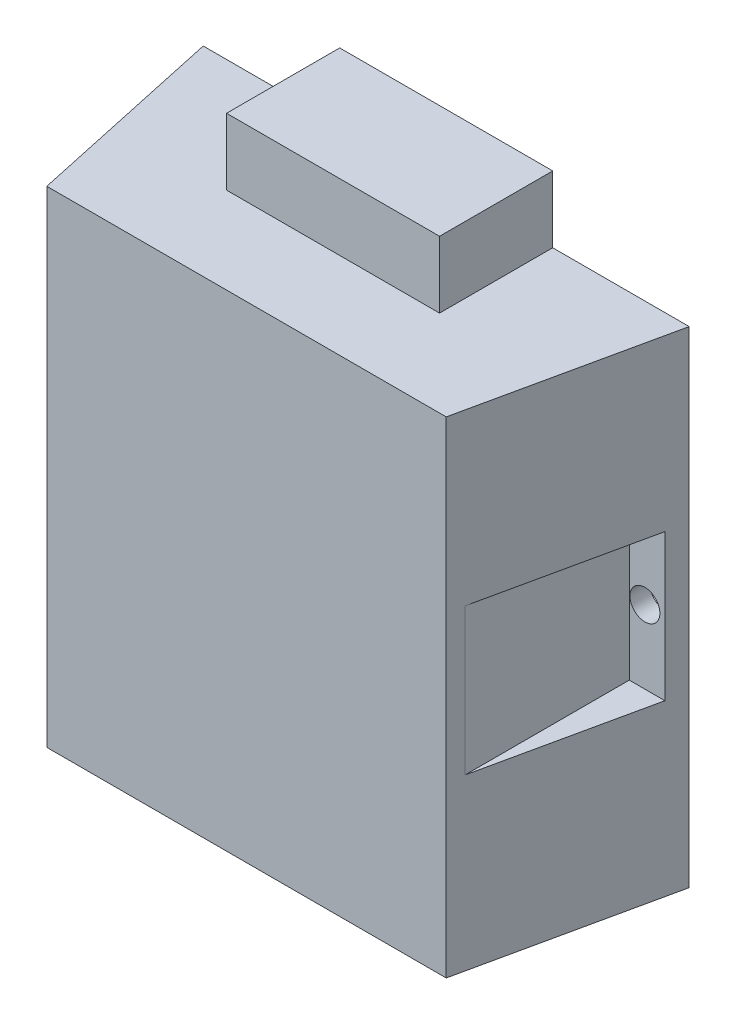
ISO-10303-21;
HEADER;
FILE_DESCRIPTION(('STEP AP214'),'2;1');
FILE_NAME('part.step','',(''),(''),'','','');
FILE_SCHEMA(('AUTOMOTIVE_DESIGN { 1 0 10303 214 1 1 1 1 }'));
ENDSEC;
DATA;
#1=APPLICATION_CONTEXT('core data for automotive mechanical design processes');
#2=APPLICATION_PROTOCOL_DEFINITION('international standard','automotive_design',2000,#1);
#3=PRODUCT_CONTEXT('',#1,'mechanical');
#4=PRODUCT('Part','Part','',(#3));
#5=PRODUCT_RELATED_PRODUCT_CATEGORY('part','',(#4));
#6=PRODUCT_DEFINITION_FORMATION('','',#4);
#7=PRODUCT_DEFINITION_CONTEXT('part definition',#1,'design');
#8=PRODUCT_DEFINITION('design','',#6,#7);
#9=PRODUCT_DEFINITION_SHAPE('','',#8);
#10=(LENGTH_UNIT() NAMED_UNIT(*) SI_UNIT(.MILLI.,.METRE.));
#11=(NAMED_UNIT(*) PLANE_ANGLE_UNIT() SI_UNIT($,.RADIAN.));
#12=(NAMED_UNIT(*) SI_UNIT($,.STERADIAN.) SOLID_ANGLE_UNIT());
#13=UNCERTAINTY_MEASURE_WITH_UNIT(LENGTH_MEASURE(1.E-05),#10,'distance_accuracy_value','');
#14=(GEOMETRIC_REPRESENTATION_CONTEXT(3) GLOBAL_UNCERTAINTY_ASSIGNED_CONTEXT((#13)) GLOBAL_UNIT_ASSIGNED_CONTEXT((#10,
#11,#12)) REPRESENTATION_CONTEXT('',''));
#15=CARTESIAN_POINT('',(0.,0.,0.));
#16=DIRECTION('',(0.,0.,1.));
#17=DIRECTION('',(1.,0.,0.));
#18=AXIS2_PLACEMENT_3D('',#15,#16,#17);
#19=CARTESIAN_POINT('',(0.,73.,0.));
#20=DIRECTION('',(0.,-1.,0.));
#21=DIRECTION('',(0.,0.,-1.));
#22=AXIS2_PLACEMENT_3D('',#19,#20,#21);
#23=PLANE('',#22);
#24=DIRECTION('',(0.,0.,-1.));
#25=VECTOR('',#24,1.);
#26=CARTESIAN_POINT('',(16.,73.,-13.));
#27=LINE('',#26,#25);
#28=CARTESIAN_POINT('',(16.,73.,-13.));
#29=VERTEX_POINT('',#28);
#30=CARTESIAN_POINT('',(16.,73.,-30.));
#31=VERTEX_POINT('',#30);
#32=EDGE_CURVE('E168',#29,#31,#27,.T.);
#33=ORIENTED_EDGE('',*,*,#32,.F.);
#34=DIRECTION('',(1.,0.,0.));
#35=VECTOR('',#34,1.);
#36=CARTESIAN_POINT('',(-16.,73.,-13.));
#37=LINE('',#36,#35);
#38=CARTESIAN_POINT('',(-16.,73.,-13.));
#39=VERTEX_POINT('',#38);
#40=EDGE_CURVE('E174',#39,#29,#37,.T.);
#41=ORIENTED_EDGE('',*,*,#40,.F.);
#42=DIRECTION('',(0.,0.,1.));
#43=VECTOR('',#42,1.);
#44=CARTESIAN_POINT('',(-16.,73.,-13.));
#45=LINE('',#44,#43);
#46=CARTESIAN_POINT('',(-16.,73.,-30.));
#47=VERTEX_POINT('',#46);
#48=EDGE_CURVE('E183',#47,#39,#45,.T.);
#49=ORIENTED_EDGE('',*,*,#48,.F.);
#50=DIRECTION('',(-1.,0.,0.));
#51=VECTOR('',#50,1.);
#52=CARTESIAN_POINT('',(-36.5,73.,-30.));
#53=LINE('',#52,#51);
#54=CARTESIAN_POINT('',(-36.5,73.,-30.));
#55=VERTEX_POINT('',#54);
#56=EDGE_CURVE('E208',#47,#55,#53,.T.);
#57=ORIENTED_EDGE('',*,*,#56,.T.);
#58=DIRECTION('',(0.211753347005806,0.,0.977323140026797));
#59=VECTOR('',#58,1.);
#60=CARTESIAN_POINT('',(-30.,73.,0.));
#61=LINE('',#60,#59);
#62=CARTESIAN_POINT('',(-30.,73.,0.));
#63=VERTEX_POINT('',#62);
#64=EDGE_CURVE('E200',#55,#63,#61,.T.);
#65=ORIENTED_EDGE('',*,*,#64,.T.);
#66=DIRECTION('',(1.,0.,0.));
#67=VECTOR('',#66,1.);
#68=CARTESIAN_POINT('',(30.,73.,0.));
#69=LINE('',#68,#67);
#70=CARTESIAN_POINT('',(30.,73.,0.));
#71=VERTEX_POINT('',#70);
#72=EDGE_CURVE('E203',#63,#71,#69,.T.);
#73=ORIENTED_EDGE('',*,*,#72,.T.);
#74=DIRECTION('',(0.211753347005806,0.,-0.977323140026797));
#75=VECTOR('',#74,1.);
#76=CARTESIAN_POINT('',(36.5,73.,-30.));
#77=LINE('',#76,#75);
#78=CARTESIAN_POINT('',(36.5,73.,-30.));
#79=VERTEX_POINT('',#78);
#80=EDGE_CURVE('E206',#71,#79,#77,.T.);
#81=ORIENTED_EDGE('',*,*,#80,.T.);
#82=EDGE_CURVE('E209',#79,#31,#53,.T.);
#83=ORIENTED_EDGE('',*,*,#82,.T.);
#84=EDGE_LOOP('',(#33,#41,#49,#57,#65,#73,#81,#83));
#85=FACE_BOUND('',#84,.T.);
#86=ADVANCED_FACE('F34',(#85),#23,.F.);
#87=CARTESIAN_POINT('',(-30.,73.,0.));
#88=DIRECTION('',(0.977323140026797,0.,-0.211753347005806));
#89=DIRECTION('',(-0.211753347005806,0.,-0.977323140026797));
#90=AXIS2_PLACEMENT_3D('',#87,#88,#89);
#91=PLANE('',#90);
#92=DIRECTION('',(0.211753347005806,0.,0.977323140026797));
#93=VECTOR('',#92,1.);
#94=CARTESIAN_POINT('',(-30.,47.5,0.));
#95=LINE('',#94,#93);
#96=CARTESIAN_POINT('',(-35.85,47.5,-27.));
#97=VERTEX_POINT('',#96);
#98=CARTESIAN_POINT('',(-30.5,47.5,-2.30769230769232));
#99=VERTEX_POINT('',#98);
#100=EDGE_CURVE('E42',#97,#99,#95,.T.);
#101=ORIENTED_EDGE('',*,*,#100,.T.);
#102=DIRECTION('',(0.,-1.,0.));
#103=VECTOR('',#102,1.);
#104=CARTESIAN_POINT('',(-30.5,73.,-2.30769230769232));
#105=LINE('',#104,#103);
#106=CARTESIAN_POINT('',(-30.5,25.5,-2.30769230769232));
#107=VERTEX_POINT('',#106);
#108=EDGE_CURVE('E11',#99,#107,#105,.T.);
#109=ORIENTED_EDGE('',*,*,#108,.T.);
#110=DIRECTION('',(-0.211753347005806,0.,-0.977323140026797));
#111=VECTOR('',#110,1.);
#112=CARTESIAN_POINT('',(-30.,25.5,0.));
#113=LINE('',#112,#111);
#114=CARTESIAN_POINT('',(-35.85,25.5,-27.));
#115=VERTEX_POINT('',#114);
#116=EDGE_CURVE('E243',#107,#115,#113,.T.);
#117=ORIENTED_EDGE('',*,*,#116,.T.);
#118=DIRECTION('',(0.,1.,0.));
#119=VECTOR('',#118,1.);
#120=CARTESIAN_POINT('',(-35.85,73.,-27.));
#121=LINE('',#120,#119);
#122=EDGE_CURVE('E241',#115,#97,#121,.T.);
#123=ORIENTED_EDGE('',*,*,#122,.T.);
#124=EDGE_LOOP('',(#101,#109,#117,#123));
#125=FACE_BOUND('',#124,.T.);
#126=DIRECTION('',(0.211753347005806,0.,0.977323140026797));
#127=VECTOR('',#126,1.);
#128=CARTESIAN_POINT('',(-30.,0.,0.));
#129=LINE('',#128,#127);
#130=CARTESIAN_POINT('',(-36.5,0.,-30.));
#131=VERTEX_POINT('',#130);
#132=CARTESIAN_POINT('',(-30.,0.,0.));
#133=VERTEX_POINT('',#132);
#134=EDGE_CURVE('E199',#131,#133,#129,.T.);
#135=ORIENTED_EDGE('',*,*,#134,.T.);
#136=DIRECTION('',(0.,-1.,0.));
#137=VECTOR('',#136,1.);
#138=CARTESIAN_POINT('',(-30.,73.,0.));
#139=LINE('',#138,#137);
#140=EDGE_CURVE('E227',#63,#133,#139,.T.);
#141=ORIENTED_EDGE('',*,*,#140,.F.);
#142=ORIENTED_EDGE('',*,*,#64,.F.);
#143=DIRECTION('',(0.,-1.,0.));
#144=VECTOR('',#143,1.);
#145=CARTESIAN_POINT('',(-36.5,73.,-30.));
#146=LINE('',#145,#144);
#147=EDGE_CURVE('E211',#55,#131,#146,.T.);
#148=ORIENTED_EDGE('',*,*,#147,.T.);
#149=EDGE_LOOP('',(#135,#141,#142,#148));
#150=FACE_BOUND('',#149,.T.);
#151=ADVANCED_FACE('F36',(#125,#150),#91,.F.);
#152=CARTESIAN_POINT('',(30.,73.,0.));
#153=DIRECTION('',(0.,0.,-1.));
#154=DIRECTION('',(-1.,0.,0.));
#155=AXIS2_PLACEMENT_3D('',#152,#153,#154);
#156=PLANE('',#155);
#157=DIRECTION('',(1.,0.,0.));
#158=VECTOR('',#157,1.);
#159=CARTESIAN_POINT('',(30.,0.,0.));
#160=LINE('',#159,#158);
#161=CARTESIAN_POINT('',(30.,0.,0.));
#162=VERTEX_POINT('',#161);
#163=EDGE_CURVE('E214',#133,#162,#160,.T.);
#164=ORIENTED_EDGE('',*,*,#163,.T.);
#165=DIRECTION('',(0.,-1.,0.));
#166=VECTOR('',#165,1.);
#167=CARTESIAN_POINT('',(30.,73.,0.));
#168=LINE('',#167,#166);
#169=EDGE_CURVE('E224',#71,#162,#168,.T.);
#170=ORIENTED_EDGE('',*,*,#169,.F.);
#171=ORIENTED_EDGE('',*,*,#72,.F.);
#172=ORIENTED_EDGE('',*,*,#140,.T.);
#173=EDGE_LOOP('',(#164,#170,#171,#172));
#174=FACE_BOUND('',#173,.T.);
#175=ADVANCED_FACE('F265',(#174),#156,.F.);
#176=CARTESIAN_POINT('',(36.5,73.,-30.));
#177=DIRECTION('',(-0.977323140026797,0.,-0.211753347005806));
#178=DIRECTION('',(-0.211753347005806,0.,0.977323140026797));
#179=AXIS2_PLACEMENT_3D('',#176,#177,#178);
#180=PLANE('',#179);
#181=DIRECTION('',(0.,1.,0.));
#182=VECTOR('',#181,1.);
#183=CARTESIAN_POINT('',(30.5,73.,-2.30769230769232));
#184=LINE('',#183,#182);
#185=CARTESIAN_POINT('',(30.5,25.5,-2.30769230769234));
#186=VERTEX_POINT('',#185);
#187=CARTESIAN_POINT('',(30.5,47.5,-2.30769230769232));
#188=VERTEX_POINT('',#187);
#189=EDGE_CURVE('E235',#186,#188,#184,.T.);
#190=ORIENTED_EDGE('',*,*,#189,.T.);
#191=DIRECTION('',(0.211753347005806,0.,-0.977323140026797));
#192=VECTOR('',#191,1.);
#193=CARTESIAN_POINT('',(36.5,47.5,-30.));
#194=LINE('',#193,#192);
#195=CARTESIAN_POINT('',(35.85,47.5,-27.));
#196=VERTEX_POINT('',#195);
#197=EDGE_CURVE('E238',#188,#196,#194,.T.);
#198=ORIENTED_EDGE('',*,*,#197,.T.);
#199=DIRECTION('',(0.,1.,0.));
#200=VECTOR('',#199,1.);
#201=CARTESIAN_POINT('',(35.85,73.,-27.));
#202=LINE('',#201,#200);
#203=CARTESIAN_POINT('',(35.85,25.5,-27.));
#204=VERTEX_POINT('',#203);
#205=EDGE_CURVE('E230',#204,#196,#202,.T.);
#206=ORIENTED_EDGE('',*,*,#205,.F.);
#207=DIRECTION('',(-0.211753347005806,0.,0.977323140026797));
#208=VECTOR('',#207,1.);
#209=CARTESIAN_POINT('',(36.5,25.5,-30.));
#210=LINE('',#209,#208);
#211=EDGE_CURVE('E232',#204,#186,#210,.T.);
#212=ORIENTED_EDGE('',*,*,#211,.T.);
#213=EDGE_LOOP('',(#190,#198,#206,#212));
#214=FACE_BOUND('',#213,.T.);
#215=DIRECTION('',(0.211753347005806,0.,-0.977323140026797));
#216=VECTOR('',#215,1.);
#217=CARTESIAN_POINT('',(36.5,0.,-30.));
#218=LINE('',#217,#216);
#219=CARTESIAN_POINT('',(36.5,0.,-30.));
#220=VERTEX_POINT('',#219);
#221=EDGE_CURVE('E216',#162,#220,#218,.T.);
#222=ORIENTED_EDGE('',*,*,#221,.T.);
#223=DIRECTION('',(0.,-1.,0.));
#224=VECTOR('',#223,1.);
#225=CARTESIAN_POINT('',(36.5,73.,-30.));
#226=LINE('',#225,#224);
#227=EDGE_CURVE('E221',#79,#220,#226,.T.);
#228=ORIENTED_EDGE('',*,*,#227,.F.);
#229=ORIENTED_EDGE('',*,*,#80,.F.);
#230=ORIENTED_EDGE('',*,*,#169,.T.);
#231=EDGE_LOOP('',(#222,#228,#229,#230));
#232=FACE_BOUND('',#231,.T.);
#233=ADVANCED_FACE('F277',(#214,#232),#180,.F.);
#234=CARTESIAN_POINT('',(-36.5,73.,-30.));
#235=DIRECTION('',(0.,0.,1.));
#236=DIRECTION('',(1.,0.,0.));
#237=AXIS2_PLACEMENT_3D('',#234,#235,#236);
#238=PLANE('',#237);
#239=CARTESIAN_POINT('',(-32.85,36.5,-30.));
#240=DIRECTION('',(0.,0.,1.));
#241=DIRECTION('',(1.,0.,0.));
#242=AXIS2_PLACEMENT_3D('',#239,#240,#241);
#243=CIRCLE('',#242,2.25);
#244=CARTESIAN_POINT('',(-30.6,36.5,-30.));
#245=VERTEX_POINT('',#244);
#246=EDGE_CURVE('E344',#245,#245,#243,.T.);
#247=ORIENTED_EDGE('',*,*,#246,.T.);
#248=EDGE_LOOP('',(#247));
#249=FACE_BOUND('',#248,.T.);
#250=CARTESIAN_POINT('',(32.85,36.5,-30.));
#251=DIRECTION('',(0.,0.,1.));
#252=DIRECTION('',(1.,0.,0.));
#253=AXIS2_PLACEMENT_3D('',#250,#251,#252);
#254=CIRCLE('',#253,2.25);
#255=CARTESIAN_POINT('',(35.1,36.5,-30.));
#256=VERTEX_POINT('',#255);
#257=EDGE_CURVE('E148',#256,#256,#254,.T.);
#258=ORIENTED_EDGE('',*,*,#257,.T.);
#259=EDGE_LOOP('',(#258));
#260=FACE_BOUND('',#259,.T.);
#261=DIRECTION('',(-1.,0.,0.));
#262=VECTOR('',#261,1.);
#263=CARTESIAN_POINT('',(-36.5,0.,-30.));
#264=LINE('',#263,#262);
#265=EDGE_CURVE('E204',#220,#131,#264,.T.);
#266=ORIENTED_EDGE('',*,*,#265,.T.);
#267=ORIENTED_EDGE('',*,*,#147,.F.);
#268=ORIENTED_EDGE('',*,*,#56,.F.);
#269=DIRECTION('',(0.,-1.,0.));
#270=VECTOR('',#269,1.);
#271=CARTESIAN_POINT('',(-16.,83.,-30.));
#272=LINE('',#271,#270);
#273=CARTESIAN_POINT('',(-16.,83.,-30.));
#274=VERTEX_POINT('',#273);
#275=EDGE_CURVE('E193',#274,#47,#272,.T.);
#276=ORIENTED_EDGE('',*,*,#275,.F.);
#277=DIRECTION('',(-1.,0.,0.));
#278=VECTOR('',#277,1.);
#279=CARTESIAN_POINT('',(-16.,83.,-30.));
#280=LINE('',#279,#278);
#281=CARTESIAN_POINT('',(16.,83.,-30.));
#282=VERTEX_POINT('',#281);
#283=EDGE_CURVE('E173',#282,#274,#280,.T.);
#284=ORIENTED_EDGE('',*,*,#283,.F.);
#285=DIRECTION('',(0.,-1.,0.));
#286=VECTOR('',#285,1.);
#287=CARTESIAN_POINT('',(16.,83.,-30.));
#288=LINE('',#287,#286);
#289=EDGE_CURVE('E196',#282,#31,#288,.T.);
#290=ORIENTED_EDGE('',*,*,#289,.T.);
#291=ORIENTED_EDGE('',*,*,#82,.F.);
#292=ORIENTED_EDGE('',*,*,#227,.T.);
#293=EDGE_LOOP('',(#266,#267,#268,#276,#284,#290,#291,#292));
#294=FACE_BOUND('',#293,.T.);
#295=ADVANCED_FACE('F273',(#249,#260,#294),#238,.F.);
#296=CARTESIAN_POINT('',(0.,0.,0.));
#297=DIRECTION('',(0.,-1.,0.));
#298=DIRECTION('',(0.,0.,-1.));
#299=AXIS2_PLACEMENT_3D('',#296,#297,#298);
#300=PLANE('',#299);
#301=ORIENTED_EDGE('',*,*,#134,.F.);
#302=ORIENTED_EDGE('',*,*,#265,.F.);
#303=ORIENTED_EDGE('',*,*,#221,.F.);
#304=ORIENTED_EDGE('',*,*,#163,.F.);
#305=EDGE_LOOP('',(#301,#302,#303,#304));
#306=FACE_BOUND('',#305,.T.);
#307=ADVANCED_FACE('F270',(#306),#300,.T.);
#308=CARTESIAN_POINT('',(16.,83.,-13.));
#309=DIRECTION('',(-1.,0.,0.));
#310=DIRECTION('',(0.,0.,1.));
#311=AXIS2_PLACEMENT_3D('',#308,#309,#310);
#312=PLANE('',#311);
#313=ORIENTED_EDGE('',*,*,#32,.T.);
#314=ORIENTED_EDGE('',*,*,#289,.F.);
#315=DIRECTION('',(0.,0.,-1.));
#316=VECTOR('',#315,1.);
#317=CARTESIAN_POINT('',(16.,83.,-13.));
#318=LINE('',#317,#316);
#319=CARTESIAN_POINT('',(16.,83.,-13.));
#320=VERTEX_POINT('',#319);
#321=EDGE_CURVE('E170',#320,#282,#318,.T.);
#322=ORIENTED_EDGE('',*,*,#321,.F.);
#323=DIRECTION('',(0.,-1.,0.));
#324=VECTOR('',#323,1.);
#325=CARTESIAN_POINT('',(16.,83.,-13.));
#326=LINE('',#325,#324);
#327=EDGE_CURVE('E180',#320,#29,#326,.T.);
#328=ORIENTED_EDGE('',*,*,#327,.T.);
#329=EDGE_LOOP('',(#313,#314,#322,#328));
#330=FACE_BOUND('',#329,.T.);
#331=ADVANCED_FACE('F268',(#330),#312,.F.);
#332=CARTESIAN_POINT('',(-16.,83.,-13.));
#333=DIRECTION('',(1.,0.,0.));
#334=DIRECTION('',(0.,0.,-1.));
#335=AXIS2_PLACEMENT_3D('',#332,#333,#334);
#336=PLANE('',#335);
#337=ORIENTED_EDGE('',*,*,#48,.T.);
#338=DIRECTION('',(0.,-1.,0.));
#339=VECTOR('',#338,1.);
#340=CARTESIAN_POINT('',(-16.,83.,-13.));
#341=LINE('',#340,#339);
#342=CARTESIAN_POINT('',(-16.,83.,-13.));
#343=VERTEX_POINT('',#342);
#344=EDGE_CURVE('E190',#343,#39,#341,.T.);
#345=ORIENTED_EDGE('',*,*,#344,.F.);
#346=DIRECTION('',(0.,0.,1.));
#347=VECTOR('',#346,1.);
#348=CARTESIAN_POINT('',(-16.,83.,-13.));
#349=LINE('',#348,#347);
#350=EDGE_CURVE('E176',#274,#343,#349,.T.);
#351=ORIENTED_EDGE('',*,*,#350,.F.);
#352=ORIENTED_EDGE('',*,*,#275,.T.);
#353=EDGE_LOOP('',(#337,#345,#351,#352));
#354=FACE_BOUND('',#353,.T.);
#355=ADVANCED_FACE('F301',(#354),#336,.F.);
#356=CARTESIAN_POINT('',(-16.,83.,-13.));
#357=DIRECTION('',(0.,0.,-1.));
#358=DIRECTION('',(-1.,0.,0.));
#359=AXIS2_PLACEMENT_3D('',#356,#357,#358);
#360=PLANE('',#359);
#361=ORIENTED_EDGE('',*,*,#40,.T.);
#362=ORIENTED_EDGE('',*,*,#327,.F.);
#363=DIRECTION('',(1.,0.,0.));
#364=VECTOR('',#363,1.);
#365=CARTESIAN_POINT('',(-16.,83.,-13.));
#366=LINE('',#365,#364);
#367=EDGE_CURVE('E178',#343,#320,#366,.T.);
#368=ORIENTED_EDGE('',*,*,#367,.F.);
#369=ORIENTED_EDGE('',*,*,#344,.T.);
#370=EDGE_LOOP('',(#361,#362,#368,#369));
#371=FACE_BOUND('',#370,.T.);
#372=ADVANCED_FACE('F311',(#371),#360,.F.);
#373=CARTESIAN_POINT('',(0.,83.,0.));
#374=DIRECTION('',(0.,-1.,0.));
#375=DIRECTION('',(0.,0.,-1.));
#376=AXIS2_PLACEMENT_3D('',#373,#374,#375);
#377=PLANE('',#376);
#378=ORIENTED_EDGE('',*,*,#321,.T.);
#379=ORIENTED_EDGE('',*,*,#283,.T.);
#380=ORIENTED_EDGE('',*,*,#350,.T.);
#381=ORIENTED_EDGE('',*,*,#367,.T.);
#382=EDGE_LOOP('',(#378,#379,#380,#381));
#383=FACE_BOUND('',#382,.T.);
#384=ADVANCED_FACE('F305',(#383),#377,.F.);
#385=CARTESIAN_POINT('',(36.5,47.5,0.));
#386=DIRECTION('',(0.,1.,0.));
#387=DIRECTION('',(0.,0.,1.));
#388=AXIS2_PLACEMENT_3D('',#385,#386,#387);
#389=PLANE('',#388);
#390=DIRECTION('',(0.,0.,-1.));
#391=VECTOR('',#390,1.);
#392=CARTESIAN_POINT('',(30.5,47.5,0.));
#393=LINE('',#392,#391);
#394=CARTESIAN_POINT('',(30.5,47.5,-27.));
#395=VERTEX_POINT('',#394);
#396=EDGE_CURVE('E166',#188,#395,#393,.T.);
#397=ORIENTED_EDGE('',*,*,#396,.T.);
#398=DIRECTION('',(1.,0.,0.));
#399=VECTOR('',#398,1.);
#400=CARTESIAN_POINT('',(36.5,47.5,-27.));
#401=LINE('',#400,#399);
#402=EDGE_CURVE('E157',#395,#196,#401,.T.);
#403=ORIENTED_EDGE('',*,*,#402,.T.);
#404=ORIENTED_EDGE('',*,*,#197,.F.);
#405=EDGE_LOOP('',(#397,#403,#404));
#406=FACE_BOUND('',#405,.T.);
#407=ADVANCED_FACE('F318',(#406),#389,.F.);
#408=CARTESIAN_POINT('',(30.5,47.5,0.));
#409=DIRECTION('',(-1.,0.,0.));
#410=DIRECTION('',(0.,0.,1.));
#411=AXIS2_PLACEMENT_3D('',#408,#409,#410);
#412=PLANE('',#411);
#413=DIRECTION('',(0.,0.,-1.));
#414=VECTOR('',#413,1.);
#415=CARTESIAN_POINT('',(30.5,25.5,0.));
#416=LINE('',#415,#414);
#417=CARTESIAN_POINT('',(30.5,25.5,-27.));
#418=VERTEX_POINT('',#417);
#419=EDGE_CURVE('E165',#186,#418,#416,.T.);
#420=ORIENTED_EDGE('',*,*,#419,.T.);
#421=DIRECTION('',(0.,1.,0.));
#422=VECTOR('',#421,1.);
#423=CARTESIAN_POINT('',(30.5,47.5,-27.));
#424=LINE('',#423,#422);
#425=EDGE_CURVE('E162',#418,#395,#424,.T.);
#426=ORIENTED_EDGE('',*,*,#425,.T.);
#427=ORIENTED_EDGE('',*,*,#396,.F.);
#428=ORIENTED_EDGE('',*,*,#189,.F.);
#429=EDGE_LOOP('',(#420,#426,#427,#428));
#430=FACE_BOUND('',#429,.T.);
#431=ADVANCED_FACE('F323',(#430),#412,.F.);
#432=CARTESIAN_POINT('',(30.5,25.5,0.));
#433=DIRECTION('',(0.,-1.,0.));
#434=DIRECTION('',(0.,0.,-1.));
#435=AXIS2_PLACEMENT_3D('',#432,#433,#434);
#436=PLANE('',#435);
#437=DIRECTION('',(-1.,0.,0.));
#438=VECTOR('',#437,1.);
#439=CARTESIAN_POINT('',(30.5,25.5,-27.));
#440=LINE('',#439,#438);
#441=EDGE_CURVE('E57',#204,#418,#440,.T.);
#442=ORIENTED_EDGE('',*,*,#441,.T.);
#443=ORIENTED_EDGE('',*,*,#419,.F.);
#444=ORIENTED_EDGE('',*,*,#211,.F.);
#445=EDGE_LOOP('',(#442,#443,#444));
#446=FACE_BOUND('',#445,.T.);
#447=ADVANCED_FACE('F325',(#446),#436,.F.);
#448=CARTESIAN_POINT('',(0.,0.,-27.));
#449=DIRECTION('',(0.,0.,1.));
#450=DIRECTION('',(1.,0.,0.));
#451=AXIS2_PLACEMENT_3D('',#448,#449,#450);
#452=PLANE('',#451);
#453=CARTESIAN_POINT('',(32.85,36.5,-27.));
#454=DIRECTION('',(0.,0.,1.));
#455=DIRECTION('',(1.,0.,0.));
#456=AXIS2_PLACEMENT_3D('',#453,#454,#455);
#457=CIRCLE('',#456,2.25);
#458=CARTESIAN_POINT('',(35.1,36.5,-27.));
#459=VERTEX_POINT('',#458);
#460=EDGE_CURVE('E338',#459,#459,#457,.T.);
#461=ORIENTED_EDGE('',*,*,#460,.F.);
#462=EDGE_LOOP('',(#461));
#463=FACE_BOUND('',#462,.T.);
#464=ORIENTED_EDGE('',*,*,#205,.T.);
#465=ORIENTED_EDGE('',*,*,#402,.F.);
#466=ORIENTED_EDGE('',*,*,#425,.F.);
#467=ORIENTED_EDGE('',*,*,#441,.F.);
#468=EDGE_LOOP('',(#464,#465,#466,#467));
#469=FACE_BOUND('',#468,.T.);
#470=ADVANCED_FACE('F256',(#463,#469),#452,.T.);
#471=CARTESIAN_POINT('',(-36.5,47.5,0.));
#472=DIRECTION('',(0.,1.,0.));
#473=DIRECTION('',(0.,0.,1.));
#474=AXIS2_PLACEMENT_3D('',#471,#472,#473);
#475=PLANE('',#474);
#476=DIRECTION('',(1.,0.,0.));
#477=VECTOR('',#476,1.);
#478=CARTESIAN_POINT('',(-36.5,47.5,-27.));
#479=LINE('',#478,#477);
#480=CARTESIAN_POINT('',(-30.5,47.5,-27.));
#481=VERTEX_POINT('',#480);
#482=EDGE_CURVE('E49',#97,#481,#479,.T.);
#483=ORIENTED_EDGE('',*,*,#482,.T.);
#484=DIRECTION('',(0.,0.,-1.));
#485=VECTOR('',#484,1.);
#486=CARTESIAN_POINT('',(-30.5,47.5,0.));
#487=LINE('',#486,#485);
#488=EDGE_CURVE('E137',#99,#481,#487,.T.);
#489=ORIENTED_EDGE('',*,*,#488,.F.);
#490=ORIENTED_EDGE('',*,*,#100,.F.);
#491=EDGE_LOOP('',(#483,#489,#490));
#492=FACE_BOUND('',#491,.T.);
#493=ADVANCED_FACE('F146',(#492),#475,.F.);
#494=CARTESIAN_POINT('',(-30.5,25.5,0.));
#495=DIRECTION('',(0.,-1.,0.));
#496=DIRECTION('',(0.,0.,-1.));
#497=AXIS2_PLACEMENT_3D('',#494,#495,#496);
#498=PLANE('',#497);
#499=DIRECTION('',(0.,0.,-1.));
#500=VECTOR('',#499,1.);
#501=CARTESIAN_POINT('',(-30.5,25.5,0.));
#502=LINE('',#501,#500);
#503=CARTESIAN_POINT('',(-30.5,25.5,-27.));
#504=VERTEX_POINT('',#503);
#505=EDGE_CURVE('E143',#107,#504,#502,.T.);
#506=ORIENTED_EDGE('',*,*,#505,.T.);
#507=DIRECTION('',(-1.,0.,0.));
#508=VECTOR('',#507,1.);
#509=CARTESIAN_POINT('',(-30.5,25.5,-27.));
#510=LINE('',#509,#508);
#511=EDGE_CURVE('E144',#504,#115,#510,.T.);
#512=ORIENTED_EDGE('',*,*,#511,.T.);
#513=ORIENTED_EDGE('',*,*,#116,.F.);
#514=EDGE_LOOP('',(#506,#512,#513));
#515=FACE_BOUND('',#514,.T.);
#516=ADVANCED_FACE('F248',(#515),#498,.F.);
#517=CARTESIAN_POINT('',(-30.5,47.5,0.));
#518=DIRECTION('',(1.,0.,0.));
#519=DIRECTION('',(0.,0.,-1.));
#520=AXIS2_PLACEMENT_3D('',#517,#518,#519);
#521=PLANE('',#520);
#522=ORIENTED_EDGE('',*,*,#488,.T.);
#523=DIRECTION('',(0.,-1.,0.));
#524=VECTOR('',#523,1.);
#525=CARTESIAN_POINT('',(-30.5,47.5,-27.));
#526=LINE('',#525,#524);
#527=EDGE_CURVE('E140',#481,#504,#526,.T.);
#528=ORIENTED_EDGE('',*,*,#527,.T.);
#529=ORIENTED_EDGE('',*,*,#505,.F.);
#530=ORIENTED_EDGE('',*,*,#108,.F.);
#531=EDGE_LOOP('',(#522,#528,#529,#530));
#532=FACE_BOUND('',#531,.T.);
#533=ADVANCED_FACE('F138',(#532),#521,.F.);
#534=CARTESIAN_POINT('',(0.,0.,-27.));
#535=DIRECTION('',(0.,0.,-1.));
#536=DIRECTION('',(-1.,0.,0.));
#537=AXIS2_PLACEMENT_3D('',#534,#535,#536);
#538=PLANE('',#537);
#539=CARTESIAN_POINT('',(-32.85,36.5,-27.));
#540=DIRECTION('',(0.,0.,1.));
#541=DIRECTION('',(1.,0.,0.));
#542=AXIS2_PLACEMENT_3D('',#539,#540,#541);
#543=CIRCLE('',#542,2.25);
#544=CARTESIAN_POINT('',(-30.6,36.5,-27.));
#545=VERTEX_POINT('',#544);
#546=EDGE_CURVE('E348',#545,#545,#543,.T.);
#547=ORIENTED_EDGE('',*,*,#546,.F.);
#548=EDGE_LOOP('',(#547));
#549=FACE_BOUND('',#548,.T.);
#550=ORIENTED_EDGE('',*,*,#511,.F.);
#551=ORIENTED_EDGE('',*,*,#527,.F.);
#552=ORIENTED_EDGE('',*,*,#482,.F.);
#553=ORIENTED_EDGE('',*,*,#122,.F.);
#554=EDGE_LOOP('',(#550,#551,#552,#553));
#555=FACE_BOUND('',#554,.T.);
#556=ADVANCED_FACE('F151',(#549,#555),#538,.F.);
#557=CARTESIAN_POINT('',(32.85,36.5,-37.));
#558=DIRECTION('',(0.,0.,1.));
#559=DIRECTION('',(1.,0.,0.));
#560=AXIS2_PLACEMENT_3D('',#557,#558,#559);
#561=CYLINDRICAL_SURFACE('',#560,2.25);
#562=ORIENTED_EDGE('',*,*,#460,.T.);
#563=EDGE_LOOP('',(#562));
#564=FACE_BOUND('',#563,.T.);
#565=ORIENTED_EDGE('',*,*,#257,.F.);
#566=EDGE_LOOP('',(#565));
#567=FACE_BOUND('',#566,.T.);
#568=ADVANCED_FACE('F358',(#564,#567),#561,.F.);
#569=CARTESIAN_POINT('',(-32.85,36.5,-37.));
#570=DIRECTION('',(0.,0.,1.));
#571=DIRECTION('',(1.,0.,0.));
#572=AXIS2_PLACEMENT_3D('',#569,#570,#571);
#573=CYLINDRICAL_SURFACE('',#572,2.25);
#574=ORIENTED_EDGE('',*,*,#546,.T.);
#575=EDGE_LOOP('',(#574));
#576=FACE_BOUND('',#575,.T.);
#577=ORIENTED_EDGE('',*,*,#246,.F.);
#578=EDGE_LOOP('',(#577));
#579=FACE_BOUND('',#578,.T.);
#580=ADVANCED_FACE('F354',(#576,#579),#573,.F.);
#581=CLOSED_SHELL('',(#86,#151,#175,#233,#295,#307,#331,#355,#372,#384,#407,#431,#447,#470,#493,
#516,#533,#556,#568,#580));
#582=MANIFOLD_SOLID_BREP('B2',#581);
#583=ADVANCED_BREP_SHAPE_REPRESENTATION('',(#18,#582),#14);
#584=SHAPE_DEFINITION_REPRESENTATION(#9,#583);
ENDSEC;
END-ISO-10303-21;
